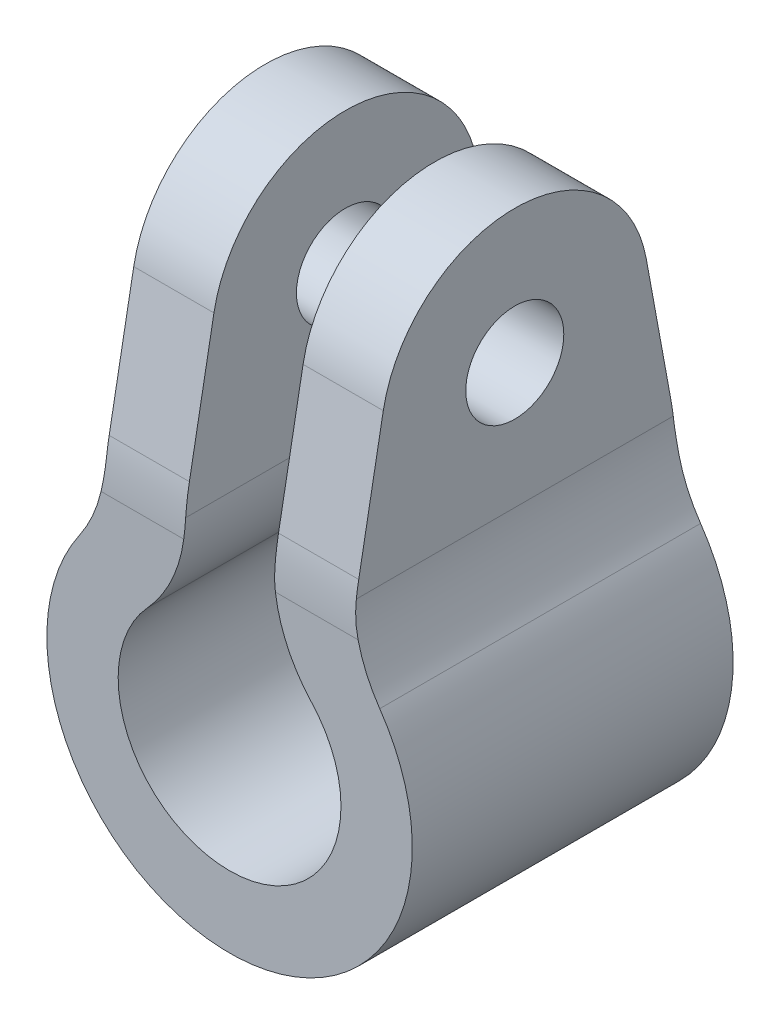
ISO-10303-21;
HEADER;
FILE_DESCRIPTION(('STEP AP214'),'2;1');
FILE_NAME('part.step','',(''),(''),'','','');
FILE_SCHEMA(('AUTOMOTIVE_DESIGN { 1 0 10303 214 1 1 1 1 }'));
ENDSEC;
DATA;
#1=APPLICATION_CONTEXT('core data for automotive mechanical design processes');
#2=APPLICATION_PROTOCOL_DEFINITION('international standard','automotive_design',2000,#1);
#3=PRODUCT_CONTEXT('',#1,'mechanical');
#4=PRODUCT('Part','Part','',(#3));
#5=PRODUCT_RELATED_PRODUCT_CATEGORY('part','',(#4));
#6=PRODUCT_DEFINITION_FORMATION('','',#4);
#7=PRODUCT_DEFINITION_CONTEXT('part definition',#1,'design');
#8=PRODUCT_DEFINITION('design','',#6,#7);
#9=PRODUCT_DEFINITION_SHAPE('','',#8);
#10=(LENGTH_UNIT() NAMED_UNIT(*) SI_UNIT(.MILLI.,.METRE.));
#11=(NAMED_UNIT(*) PLANE_ANGLE_UNIT() SI_UNIT($,.RADIAN.));
#12=(NAMED_UNIT(*) SI_UNIT($,.STERADIAN.) SOLID_ANGLE_UNIT());
#13=UNCERTAINTY_MEASURE_WITH_UNIT(LENGTH_MEASURE(1.E-05),#10,'distance_accuracy_value','');
#14=(GEOMETRIC_REPRESENTATION_CONTEXT(3) GLOBAL_UNCERTAINTY_ASSIGNED_CONTEXT((#13)) GLOBAL_UNIT_ASSIGNED_CONTEXT((#10,
#11,#12)) REPRESENTATION_CONTEXT('',''));
#15=CARTESIAN_POINT('',(0.,0.,0.));
#16=DIRECTION('',(0.,0.,1.));
#17=DIRECTION('',(1.,0.,0.));
#18=AXIS2_PLACEMENT_3D('',#15,#16,#17);
#19=CARTESIAN_POINT('',(7.,9.94044767603552,-9.));
#20=DIRECTION('',(0.,-0.180327868852459,0.983606557377049));
#21=DIRECTION('',(0.,-0.983606557377049,-0.180327868852459));
#22=AXIS2_PLACEMENT_3D('',#19,#20,#21);
#23=PLANE('',#22);
#24=DIRECTION('',(0.,-0.983606557377049,-0.180327868852459));
#25=VECTOR('',#24,1.);
#26=CARTESIAN_POINT('',(-2.5,9.94044767603552,-9.));
#27=LINE('',#26,#25);
#28=CARTESIAN_POINT('',(-2.5,18.792906692429,-7.37704918032787));
#29=VERTEX_POINT('',#28);
#30=CARTESIAN_POINT('',(-2.5,11.281729345186,-8.75409836065574));
#31=VERTEX_POINT('',#30);
#32=EDGE_CURVE('E452',#29,#31,#27,.T.);
#33=ORIENTED_EDGE('',*,*,#32,.T.);
#34=DIRECTION('',(-1.,0.,0.));
#35=VECTOR('',#34,1.);
#36=CARTESIAN_POINT('',(7.,11.281729345186,-8.75409836065574));
#37=LINE('',#36,#35);
#38=CARTESIAN_POINT('',(-7.,11.281729345186,-8.75409836065574));
#39=VERTEX_POINT('',#38);
#40=EDGE_CURVE('E11',#31,#39,#37,.T.);
#41=ORIENTED_EDGE('',*,*,#40,.T.);
#42=DIRECTION('',(0.,0.983606557377049,0.180327868852459));
#43=VECTOR('',#42,1.);
#44=CARTESIAN_POINT('',(-7.,9.94044767603552,-9.));
#45=LINE('',#44,#43);
#46=CARTESIAN_POINT('',(-7.,18.792906692429,-7.37704918032787));
#47=VERTEX_POINT('',#46);
#48=EDGE_CURVE('E461',#39,#47,#45,.T.);
#49=ORIENTED_EDGE('',*,*,#48,.T.);
#50=DIRECTION('',(-1.,0.,0.));
#51=VECTOR('',#50,1.);
#52=CARTESIAN_POINT('',(7.,18.792906692429,-7.37704918032787));
#53=LINE('',#52,#51);
#54=EDGE_CURVE('E204',#29,#47,#53,.T.);
#55=ORIENTED_EDGE('',*,*,#54,.F.);
#56=EDGE_LOOP('',(#33,#41,#49,#55));
#57=FACE_BOUND('',#56,.T.);
#58=ADVANCED_FACE('F38',(#57),#23,.F.);
#59=CARTESIAN_POINT('',(7.,17.4404476760355,0.));
#60=DIRECTION('',(-1.,0.,0.));
#61=DIRECTION('',(0.,0.,1.));
#62=AXIS2_PLACEMENT_3D('',#59,#60,#61);
#63=CYLINDRICAL_SURFACE('',#62,7.5);
#64=CARTESIAN_POINT('',(-2.5,17.4404476760355,0.));
#65=DIRECTION('',(-1.,0.,0.));
#66=DIRECTION('',(0.,0.,1.));
#67=AXIS2_PLACEMENT_3D('',#64,#65,#66);
#68=CIRCLE('',#67,7.5);
#69=CARTESIAN_POINT('',(-2.5,18.792906692429,7.37704918032787));
#70=VERTEX_POINT('',#69);
#71=EDGE_CURVE('E449',#70,#29,#68,.T.);
#72=ORIENTED_EDGE('',*,*,#71,.T.);
#73=ORIENTED_EDGE('',*,*,#54,.T.);
#74=CARTESIAN_POINT('',(-7.,17.4404476760355,0.));
#75=DIRECTION('',(1.,0.,0.));
#76=DIRECTION('',(0.,0.,-1.));
#77=AXIS2_PLACEMENT_3D('',#74,#75,#76);
#78=CIRCLE('',#77,7.5);
#79=CARTESIAN_POINT('',(-7.,18.792906692429,7.37704918032787));
#80=VERTEX_POINT('',#79);
#81=EDGE_CURVE('E466',#47,#80,#78,.T.);
#82=ORIENTED_EDGE('',*,*,#81,.T.);
#83=DIRECTION('',(-1.,0.,0.));
#84=VECTOR('',#83,1.);
#85=CARTESIAN_POINT('',(7.,18.792906692429,7.37704918032787));
#86=LINE('',#85,#84);
#87=EDGE_CURVE('E205',#70,#80,#86,.T.);
#88=ORIENTED_EDGE('',*,*,#87,.F.);
#89=EDGE_LOOP('',(#72,#73,#82,#88));
#90=FACE_BOUND('',#89,.T.);
#91=ADVANCED_FACE('F362',(#90),#63,.T.);
#92=CARTESIAN_POINT('',(7.,9.94044767603552,9.));
#93=DIRECTION('',(0.,-0.180327868852459,-0.983606557377049));
#94=DIRECTION('',(0.,0.983606557377049,-0.180327868852459));
#95=AXIS2_PLACEMENT_3D('',#92,#93,#94);
#96=PLANE('',#95);
#97=DIRECTION('',(0.,-0.983606557377049,0.180327868852459));
#98=VECTOR('',#97,1.);
#99=CARTESIAN_POINT('',(-7.,9.94044767603552,9.));
#100=LINE('',#99,#98);
#101=CARTESIAN_POINT('',(-7.,11.2817293451861,8.75409836065573));
#102=VERTEX_POINT('',#101);
#103=EDGE_CURVE('E210',#80,#102,#100,.T.);
#104=ORIENTED_EDGE('',*,*,#103,.T.);
#105=DIRECTION('',(-1.,0.,0.));
#106=VECTOR('',#105,1.);
#107=CARTESIAN_POINT('',(-2.5,11.2817293451861,8.75409836065573));
#108=LINE('',#107,#106);
#109=CARTESIAN_POINT('',(-2.5,11.2817293451861,8.75409836065573));
#110=VERTEX_POINT('',#109);
#111=EDGE_CURVE('E425',#102,#110,#108,.F.);
#112=ORIENTED_EDGE('',*,*,#111,.T.);
#113=DIRECTION('',(0.,0.983606557377049,-0.180327868852459));
#114=VECTOR('',#113,1.);
#115=CARTESIAN_POINT('',(-2.5,9.94044767603552,9.));
#116=LINE('',#115,#114);
#117=EDGE_CURVE('E228',#110,#70,#116,.T.);
#118=ORIENTED_EDGE('',*,*,#117,.T.);
#119=ORIENTED_EDGE('',*,*,#87,.T.);
#120=EDGE_LOOP('',(#104,#112,#118,#119));
#121=FACE_BOUND('',#120,.T.);
#122=ADVANCED_FACE('F371',(#121),#96,.F.);
#123=CARTESIAN_POINT('',(7.,17.4404476760355,0.));
#124=DIRECTION('',(-1.,0.,0.));
#125=DIRECTION('',(0.,0.,1.));
#126=AXIS2_PLACEMENT_3D('',#123,#124,#125);
#127=CYLINDRICAL_SURFACE('',#126,2.75);
#128=CARTESIAN_POINT('',(-2.5,17.4404476760355,0.));
#129=DIRECTION('',(-1.,0.,0.));
#130=DIRECTION('',(0.,0.,1.));
#131=AXIS2_PLACEMENT_3D('',#128,#129,#130);
#132=CIRCLE('',#131,2.75);
#133=CARTESIAN_POINT('',(-2.5,17.4404476760355,2.75));
#134=VERTEX_POINT('',#133);
#135=EDGE_CURVE('E225',#134,#134,#132,.T.);
#136=ORIENTED_EDGE('',*,*,#135,.F.);
#137=EDGE_LOOP('',(#136));
#138=FACE_BOUND('',#137,.T.);
#139=CARTESIAN_POINT('',(-7.,17.4404476760355,0.));
#140=DIRECTION('',(1.,0.,0.));
#141=DIRECTION('',(0.,0.,-1.));
#142=AXIS2_PLACEMENT_3D('',#139,#140,#141);
#143=CIRCLE('',#142,2.75);
#144=CARTESIAN_POINT('',(-7.,17.4404476760355,-2.75));
#145=VERTEX_POINT('',#144);
#146=EDGE_CURVE('E457',#145,#145,#143,.T.);
#147=ORIENTED_EDGE('',*,*,#146,.F.);
#148=EDGE_LOOP('',(#147));
#149=FACE_BOUND('',#148,.T.);
#150=ADVANCED_FACE('F508',(#138,#149),#127,.F.);
#151=CARTESIAN_POINT('',(0.,0.,9.));
#152=DIRECTION('',(0.,0.,-1.));
#153=DIRECTION('',(-1.,0.,0.));
#154=AXIS2_PLACEMENT_3D('',#151,#152,#153);
#155=CYLINDRICAL_SURFACE('',#154,10.25);
#156=CARTESIAN_POINT('',(0.,0.,9.));
#157=DIRECTION('',(0.,0.,1.));
#158=DIRECTION('',(1.,0.,0.));
#159=AXIS2_PLACEMENT_3D('',#156,#157,#158);
#160=CIRCLE('',#159,10.25);
#161=CARTESIAN_POINT('',(-8.42465753424658,5.83846259135592,9.));
#162=VERTEX_POINT('',#161);
#163=CARTESIAN_POINT('',(8.42465753424658,5.83846259135592,9.));
#164=VERTEX_POINT('',#163);
#165=EDGE_CURVE('E214',#162,#164,#160,.T.);
#166=ORIENTED_EDGE('',*,*,#165,.F.);
#167=DIRECTION('',(0.,0.,-1.));
#168=VECTOR('',#167,1.);
#169=CARTESIAN_POINT('',(-8.42465753424658,5.83846259135592,9.));
#170=LINE('',#169,#168);
#171=CARTESIAN_POINT('',(-8.42465753424658,5.83846259135592,-9.));
#172=VERTEX_POINT('',#171);
#173=EDGE_CURVE('E470',#162,#172,#170,.T.);
#174=ORIENTED_EDGE('',*,*,#173,.T.);
#175=CARTESIAN_POINT('',(0.,0.,-9.));
#176=DIRECTION('',(0.,0.,1.));
#177=DIRECTION('',(1.,0.,0.));
#178=AXIS2_PLACEMENT_3D('',#175,#176,#177);
#179=CIRCLE('',#178,10.25);
#180=CARTESIAN_POINT('',(8.42465753424658,5.83846259135592,-9.));
#181=VERTEX_POINT('',#180);
#182=EDGE_CURVE('E213',#172,#181,#179,.T.);
#183=ORIENTED_EDGE('',*,*,#182,.T.);
#184=DIRECTION('',(0.,0.,-1.));
#185=VECTOR('',#184,1.);
#186=CARTESIAN_POINT('',(8.42465753424658,5.83846259135592,9.));
#187=LINE('',#186,#185);
#188=EDGE_CURVE('E439',#181,#164,#187,.F.);
#189=ORIENTED_EDGE('',*,*,#188,.T.);
#190=EDGE_LOOP('',(#166,#174,#183,#189));
#191=FACE_BOUND('',#190,.T.);
#192=ADVANCED_FACE('F296',(#191),#155,.T.);
#193=CARTESIAN_POINT('',(0.,0.,9.));
#194=DIRECTION('',(0.,0.,-1.));
#195=DIRECTION('',(-1.,0.,0.));
#196=AXIS2_PLACEMENT_3D('',#193,#194,#195);
#197=CYLINDRICAL_SURFACE('',#196,6.25);
#198=CARTESIAN_POINT('',(0.,0.,-9.));
#199=DIRECTION('',(0.,0.,-1.));
#200=DIRECTION('',(1.,0.,0.));
#201=AXIS2_PLACEMENT_3D('',#198,#199,#200);
#202=CIRCLE('',#201,6.25);
#203=CARTESIAN_POINT('',(4.60526315789474,4.22540545350827,-9.));
#204=VERTEX_POINT('',#203);
#205=CARTESIAN_POINT('',(-4.60526315789474,4.22540545350827,-9.));
#206=VERTEX_POINT('',#205);
#207=EDGE_CURVE('E218',#204,#206,#202,.T.);
#208=ORIENTED_EDGE('',*,*,#207,.T.);
#209=DIRECTION('',(0.,0.,-1.));
#210=VECTOR('',#209,1.);
#211=CARTESIAN_POINT('',(-4.60526315789474,4.22540545350827,9.));
#212=LINE('',#211,#210);
#213=CARTESIAN_POINT('',(-4.60526315789474,4.22540545350827,9.));
#214=VERTEX_POINT('',#213);
#215=EDGE_CURVE('E241',#206,#214,#212,.F.);
#216=ORIENTED_EDGE('',*,*,#215,.T.);
#217=CARTESIAN_POINT('',(0.,0.,9.));
#218=DIRECTION('',(0.,0.,-1.));
#219=DIRECTION('',(1.,0.,0.));
#220=AXIS2_PLACEMENT_3D('',#217,#218,#219);
#221=CIRCLE('',#220,6.25);
#222=CARTESIAN_POINT('',(4.60526315789474,4.22540545350827,9.));
#223=VERTEX_POINT('',#222);
#224=EDGE_CURVE('E217',#223,#214,#221,.T.);
#225=ORIENTED_EDGE('',*,*,#224,.F.);
#226=DIRECTION('',(0.,0.,-1.));
#227=VECTOR('',#226,1.);
#228=CARTESIAN_POINT('',(4.60526315789474,4.22540545350827,9.));
#229=LINE('',#228,#227);
#230=EDGE_CURVE('E239',#223,#204,#229,.T.);
#231=ORIENTED_EDGE('',*,*,#230,.T.);
#232=EDGE_LOOP('',(#208,#216,#225,#231));
#233=FACE_BOUND('',#232,.T.);
#234=ADVANCED_FACE('F480',(#233),#197,.F.);
#235=CARTESIAN_POINT('',(0.,0.,9.));
#236=DIRECTION('',(0.,0.,1.));
#237=DIRECTION('',(1.,0.,0.));
#238=AXIS2_PLACEMENT_3D('',#235,#236,#237);
#239=PLANE('',#238);
#240=CARTESIAN_POINT('',(-10.5,9.63392443399885,9.));
#241=DIRECTION('',(0.,0.,1.));
#242=DIRECTION('',(1.,0.,0.));
#243=AXIS2_PLACEMENT_3D('',#240,#241,#242);
#244=CIRCLE('',#243,8.);
#245=CARTESIAN_POINT('',(-2.57015057846987,8.57681131239917,9.));
#246=VERTEX_POINT('',#245);
#247=EDGE_CURVE('E246',#214,#246,#244,.T.);
#248=ORIENTED_EDGE('',*,*,#247,.T.);
#249=DIRECTION('',(-1.,0.,0.));
#250=VECTOR('',#249,1.);
#251=CARTESIAN_POINT('',(-7.01294178352441,8.57681131239917,9.));
#252=LINE('',#251,#250);
#253=CARTESIAN_POINT('',(-7.20942509987394,8.57681131239917,9.));
#254=VERTEX_POINT('',#253);
#255=EDGE_CURVE('E271',#246,#254,#252,.T.);
#256=ORIENTED_EDGE('',*,*,#255,.T.);
#257=CARTESIAN_POINT('',(-15.,10.3953114431459,9.));
#258=DIRECTION('',(0.,0.,1.));
#259=DIRECTION('',(1.,0.,0.));
#260=AXIS2_PLACEMENT_3D('',#257,#258,#259);
#261=CIRCLE('',#260,8.);
#262=EDGE_CURVE('E258',#254,#162,#261,.F.);
#263=ORIENTED_EDGE('',*,*,#262,.T.);
#264=ORIENTED_EDGE('',*,*,#165,.T.);
#265=CARTESIAN_POINT('',(15.,10.3953114431459,9.));
#266=DIRECTION('',(0.,0.,1.));
#267=DIRECTION('',(1.,0.,0.));
#268=AXIS2_PLACEMENT_3D('',#265,#266,#267);
#269=CIRCLE('',#268,8.);
#270=CARTESIAN_POINT('',(7.20942509987394,8.57681131239917,9.));
#271=VERTEX_POINT('',#270);
#272=EDGE_CURVE('E263',#164,#271,#269,.F.);
#273=ORIENTED_EDGE('',*,*,#272,.T.);
#274=DIRECTION('',(-1.,0.,0.));
#275=VECTOR('',#274,1.);
#276=CARTESIAN_POINT('',(2.5,8.57681131239917,9.));
#277=LINE('',#276,#275);
#278=CARTESIAN_POINT('',(2.57015057846987,8.57681131239917,9.));
#279=VERTEX_POINT('',#278);
#280=EDGE_CURVE('E268',#271,#279,#277,.T.);
#281=ORIENTED_EDGE('',*,*,#280,.T.);
#282=CARTESIAN_POINT('',(10.5,9.63392443399885,9.));
#283=DIRECTION('',(0.,0.,1.));
#284=DIRECTION('',(1.,0.,0.));
#285=AXIS2_PLACEMENT_3D('',#282,#283,#284);
#286=CIRCLE('',#285,8.);
#287=EDGE_CURVE('E244',#279,#223,#286,.T.);
#288=ORIENTED_EDGE('',*,*,#287,.T.);
#289=ORIENTED_EDGE('',*,*,#224,.T.);
#290=EDGE_LOOP('',(#248,#256,#263,#264,#273,#281,#288,#289));
#291=FACE_BOUND('',#290,.T.);
#292=ADVANCED_FACE('F476',(#291),#239,.T.);
#293=CARTESIAN_POINT('',(0.,0.,-9.));
#294=DIRECTION('',(0.,0.,1.));
#295=DIRECTION('',(1.,0.,0.));
#296=AXIS2_PLACEMENT_3D('',#293,#294,#295);
#297=PLANE('',#296);
#298=CARTESIAN_POINT('',(10.5,9.63392443399885,-9.));
#299=DIRECTION('',(0.,0.,1.));
#300=DIRECTION('',(1.,0.,0.));
#301=AXIS2_PLACEMENT_3D('',#298,#299,#300);
#302=CIRCLE('',#301,8.);
#303=CARTESIAN_POINT('',(2.57015057846987,8.57681131239916,-9.));
#304=VERTEX_POINT('',#303);
#305=EDGE_CURVE('E252',#204,#304,#302,.F.);
#306=ORIENTED_EDGE('',*,*,#305,.T.);
#307=DIRECTION('',(-1.,0.,0.));
#308=VECTOR('',#307,1.);
#309=CARTESIAN_POINT('',(0.,8.57681131239916,-9.));
#310=LINE('',#309,#308);
#311=CARTESIAN_POINT('',(7.20942509987394,8.57681131239916,-9.));
#312=VERTEX_POINT('',#311);
#313=EDGE_CURVE('E47',#304,#312,#310,.F.);
#314=ORIENTED_EDGE('',*,*,#313,.T.);
#315=CARTESIAN_POINT('',(15.,10.3953114431459,-9.));
#316=DIRECTION('',(0.,0.,1.));
#317=DIRECTION('',(1.,0.,0.));
#318=AXIS2_PLACEMENT_3D('',#315,#316,#317);
#319=CIRCLE('',#318,8.);
#320=EDGE_CURVE('E266',#312,#181,#319,.T.);
#321=ORIENTED_EDGE('',*,*,#320,.T.);
#322=ORIENTED_EDGE('',*,*,#182,.F.);
#323=CARTESIAN_POINT('',(-15.,10.3953114431459,-9.));
#324=DIRECTION('',(0.,0.,1.));
#325=DIRECTION('',(1.,0.,0.));
#326=AXIS2_PLACEMENT_3D('',#323,#324,#325);
#327=CIRCLE('',#326,8.);
#328=CARTESIAN_POINT('',(-7.20942509987394,8.57681131239916,-9.));
#329=VERTEX_POINT('',#328);
#330=EDGE_CURVE('E260',#172,#329,#327,.T.);
#331=ORIENTED_EDGE('',*,*,#330,.T.);
#332=DIRECTION('',(-1.,0.,0.));
#333=VECTOR('',#332,1.);
#334=CARTESIAN_POINT('',(0.,8.57681131239916,-9.));
#335=LINE('',#334,#333);
#336=CARTESIAN_POINT('',(-2.57015057846987,8.57681131239916,-9.));
#337=VERTEX_POINT('',#336);
#338=EDGE_CURVE('E395',#329,#337,#335,.F.);
#339=ORIENTED_EDGE('',*,*,#338,.T.);
#340=CARTESIAN_POINT('',(-10.5,9.63392443399885,-9.));
#341=DIRECTION('',(0.,0.,1.));
#342=DIRECTION('',(1.,0.,0.));
#343=AXIS2_PLACEMENT_3D('',#340,#341,#342);
#344=CIRCLE('',#343,8.);
#345=EDGE_CURVE('E254',#337,#206,#344,.F.);
#346=ORIENTED_EDGE('',*,*,#345,.T.);
#347=ORIENTED_EDGE('',*,*,#207,.F.);
#348=EDGE_LOOP('',(#306,#314,#321,#322,#331,#339,#346,#347));
#349=FACE_BOUND('',#348,.T.);
#350=ADVANCED_FACE('F398',(#349),#297,.F.);
#351=CARTESIAN_POINT('',(7.,17.4404476760355,0.));
#352=DIRECTION('',(1.,0.,0.));
#353=DIRECTION('',(0.,0.,-1.));
#354=AXIS2_PLACEMENT_3D('',#351,#352,#353);
#355=PLANE('',#354);
#356=CARTESIAN_POINT('',(7.,17.4404476760355,0.));
#357=DIRECTION('',(1.,0.,0.));
#358=DIRECTION('',(0.,0.,-1.));
#359=AXIS2_PLACEMENT_3D('',#356,#357,#358);
#360=CIRCLE('',#359,2.75);
#361=CARTESIAN_POINT('',(7.,17.4404476760355,-2.75));
#362=VERTEX_POINT('',#361);
#363=EDGE_CURVE('E458',#362,#362,#360,.T.);
#364=ORIENTED_EDGE('',*,*,#363,.F.);
#365=EDGE_LOOP('',(#364));
#366=FACE_BOUND('',#365,.T.);
#367=DIRECTION('',(0.,-0.983606557377049,0.180327868852459));
#368=VECTOR('',#367,1.);
#369=CARTESIAN_POINT('',(7.,9.94044767603552,9.));
#370=LINE('',#369,#368);
#371=CARTESIAN_POINT('',(7.,18.792906692429,7.37704918032787));
#372=VERTEX_POINT('',#371);
#373=CARTESIAN_POINT('',(7.,11.2817293451861,8.75409836065573));
#374=VERTEX_POINT('',#373);
#375=EDGE_CURVE('E203',#372,#374,#370,.T.);
#376=ORIENTED_EDGE('',*,*,#375,.T.);
#377=CARTESIAN_POINT('',(7.,8.57681131239917,-6.));
#378=DIRECTION('',(1.,0.,0.));
#379=DIRECTION('',(0.,0.,-1.));
#380=AXIS2_PLACEMENT_3D('',#377,#378,#379);
#381=CIRCLE('',#380,15.);
#382=CARTESIAN_POINT('',(7.,10.3953114431459,8.88936053947496));
#383=VERTEX_POINT('',#382);
#384=EDGE_CURVE('E485',#374,#383,#381,.T.);
#385=ORIENTED_EDGE('',*,*,#384,.T.);
#386=DIRECTION('',(0.,0.,-1.));
#387=VECTOR('',#386,1.);
#388=CARTESIAN_POINT('',(7.,10.3953114431459,0.));
#389=LINE('',#388,#387);
#390=CARTESIAN_POINT('',(7.,10.3953114431459,-8.88936053947496));
#391=VERTEX_POINT('',#390);
#392=EDGE_CURVE('E237',#383,#391,#389,.T.);
#393=ORIENTED_EDGE('',*,*,#392,.T.);
#394=CARTESIAN_POINT('',(7.,8.57681131239916,6.));
#395=DIRECTION('',(1.,0.,0.));
#396=DIRECTION('',(0.,0.,-1.));
#397=AXIS2_PLACEMENT_3D('',#394,#395,#396);
#398=CIRCLE('',#397,15.);
#399=CARTESIAN_POINT('',(7.,11.281729345186,-8.75409836065574));
#400=VERTEX_POINT('',#399);
#401=EDGE_CURVE('E61',#391,#400,#398,.T.);
#402=ORIENTED_EDGE('',*,*,#401,.T.);
#403=DIRECTION('',(0.,0.983606557377049,0.180327868852459));
#404=VECTOR('',#403,1.);
#405=CARTESIAN_POINT('',(7.,9.94044767603552,-9.));
#406=LINE('',#405,#404);
#407=CARTESIAN_POINT('',(7.,18.792906692429,-7.37704918032787));
#408=VERTEX_POINT('',#407);
#409=EDGE_CURVE('E388',#400,#408,#406,.T.);
#410=ORIENTED_EDGE('',*,*,#409,.T.);
#411=CARTESIAN_POINT('',(7.,17.4404476760355,0.));
#412=DIRECTION('',(1.,0.,0.));
#413=DIRECTION('',(0.,0.,-1.));
#414=AXIS2_PLACEMENT_3D('',#411,#412,#413);
#415=CIRCLE('',#414,7.5);
#416=EDGE_CURVE('E390',#408,#372,#415,.T.);
#417=ORIENTED_EDGE('',*,*,#416,.T.);
#418=EDGE_LOOP('',(#376,#385,#393,#402,#410,#417));
#419=FACE_BOUND('',#418,.T.);
#420=ADVANCED_FACE('F384',(#366,#419),#355,.T.);
#421=CARTESIAN_POINT('',(-7.,17.4404476760355,0.));
#422=DIRECTION('',(1.,0.,0.));
#423=DIRECTION('',(0.,0.,-1.));
#424=AXIS2_PLACEMENT_3D('',#421,#422,#423);
#425=PLANE('',#424);
#426=ORIENTED_EDGE('',*,*,#146,.T.);
#427=EDGE_LOOP('',(#426));
#428=FACE_BOUND('',#427,.T.);
#429=DIRECTION('',(0.,0.,1.));
#430=VECTOR('',#429,1.);
#431=CARTESIAN_POINT('',(-7.,10.3953114431459,9.));
#432=LINE('',#431,#430);
#433=CARTESIAN_POINT('',(-7.,10.3953114431459,-8.88936053947496));
#434=VERTEX_POINT('',#433);
#435=CARTESIAN_POINT('',(-7.,10.3953114431459,8.88936053947496));
#436=VERTEX_POINT('',#435);
#437=EDGE_CURVE('E231',#434,#436,#432,.T.);
#438=ORIENTED_EDGE('',*,*,#437,.T.);
#439=CARTESIAN_POINT('',(-7.,8.57681131239917,-6.));
#440=DIRECTION('',(1.,0.,0.));
#441=DIRECTION('',(0.,0.,-1.));
#442=AXIS2_PLACEMENT_3D('',#439,#440,#441);
#443=CIRCLE('',#442,15.);
#444=EDGE_CURVE('E427',#436,#102,#443,.F.);
#445=ORIENTED_EDGE('',*,*,#444,.T.);
#446=ORIENTED_EDGE('',*,*,#103,.F.);
#447=ORIENTED_EDGE('',*,*,#81,.F.);
#448=ORIENTED_EDGE('',*,*,#48,.F.);
#449=CARTESIAN_POINT('',(-7.,8.57681131239916,6.));
#450=DIRECTION('',(1.,0.,0.));
#451=DIRECTION('',(0.,0.,-1.));
#452=AXIS2_PLACEMENT_3D('',#449,#450,#451);
#453=CIRCLE('',#452,15.);
#454=EDGE_CURVE('E428',#39,#434,#453,.F.);
#455=ORIENTED_EDGE('',*,*,#454,.T.);
#456=EDGE_LOOP('',(#438,#445,#446,#447,#448,#455));
#457=FACE_BOUND('',#456,.T.);
#458=ADVANCED_FACE('F377',(#428,#457),#425,.F.);
#459=ORIENTED_EDGE('',*,*,#409,.F.);
#460=DIRECTION('',(-1.,0.,0.));
#461=VECTOR('',#460,1.);
#462=CARTESIAN_POINT('',(7.,11.281729345186,-8.75409836065574));
#463=LINE('',#462,#461);
#464=CARTESIAN_POINT('',(2.5,11.281729345186,-8.75409836065574));
#465=VERTEX_POINT('',#464);
#466=EDGE_CURVE('E322',#400,#465,#463,.T.);
#467=ORIENTED_EDGE('',*,*,#466,.T.);
#468=DIRECTION('',(0.,0.983606557377049,0.180327868852459));
#469=VECTOR('',#468,1.);
#470=CARTESIAN_POINT('',(2.5,9.94044767603552,-9.));
#471=LINE('',#470,#469);
#472=CARTESIAN_POINT('',(2.5,18.792906692429,-7.37704918032787));
#473=VERTEX_POINT('',#472);
#474=EDGE_CURVE('E189',#465,#473,#471,.T.);
#475=ORIENTED_EDGE('',*,*,#474,.T.);
#476=EDGE_CURVE('E186',#408,#473,#53,.T.);
#477=ORIENTED_EDGE('',*,*,#476,.F.);
#478=EDGE_LOOP('',(#459,#467,#475,#477));
#479=FACE_BOUND('',#478,.T.);
#480=ADVANCED_FACE('F365',(#479),#23,.F.);
#481=CARTESIAN_POINT('',(2.5,17.4404476760355,0.));
#482=DIRECTION('',(1.,0.,0.));
#483=DIRECTION('',(0.,1.,0.));
#484=AXIS2_PLACEMENT_3D('',#481,#482,#483);
#485=CIRCLE('',#484,7.5);
#486=CARTESIAN_POINT('',(2.5,18.792906692429,7.37704918032787));
#487=VERTEX_POINT('',#486);
#488=EDGE_CURVE('E178',#473,#487,#485,.T.);
#489=ORIENTED_EDGE('',*,*,#488,.T.);
#490=EDGE_CURVE('E183',#372,#487,#86,.T.);
#491=ORIENTED_EDGE('',*,*,#490,.F.);
#492=ORIENTED_EDGE('',*,*,#416,.F.);
#493=ORIENTED_EDGE('',*,*,#476,.T.);
#494=EDGE_LOOP('',(#489,#491,#492,#493));
#495=FACE_BOUND('',#494,.T.);
#496=ADVANCED_FACE('F180',(#495),#63,.T.);
#497=DIRECTION('',(0.,-0.983606557377049,0.180327868852459));
#498=VECTOR('',#497,1.);
#499=CARTESIAN_POINT('',(2.5,9.94044767603552,9.));
#500=LINE('',#499,#498);
#501=CARTESIAN_POINT('',(2.5,11.2817293451861,8.75409836065573));
#502=VERTEX_POINT('',#501);
#503=EDGE_CURVE('E190',#487,#502,#500,.T.);
#504=ORIENTED_EDGE('',*,*,#503,.T.);
#505=DIRECTION('',(-1.,0.,0.));
#506=VECTOR('',#505,1.);
#507=CARTESIAN_POINT('',(7.01294178352441,11.2817293451861,8.75409836065573));
#508=LINE('',#507,#506);
#509=EDGE_CURVE('E487',#502,#374,#508,.F.);
#510=ORIENTED_EDGE('',*,*,#509,.T.);
#511=ORIENTED_EDGE('',*,*,#375,.F.);
#512=ORIENTED_EDGE('',*,*,#490,.T.);
#513=EDGE_LOOP('',(#504,#510,#511,#512));
#514=FACE_BOUND('',#513,.T.);
#515=ADVANCED_FACE('F201',(#514),#96,.F.);
#516=CARTESIAN_POINT('',(2.5,17.4404476760355,0.));
#517=DIRECTION('',(1.,0.,0.));
#518=DIRECTION('',(0.,1.,0.));
#519=AXIS2_PLACEMENT_3D('',#516,#517,#518);
#520=CIRCLE('',#519,2.75);
#521=CARTESIAN_POINT('',(2.5,20.1904476760355,0.));
#522=VERTEX_POINT('',#521);
#523=EDGE_CURVE('E199',#522,#522,#520,.T.);
#524=ORIENTED_EDGE('',*,*,#523,.F.);
#525=EDGE_LOOP('',(#524));
#526=FACE_BOUND('',#525,.T.);
#527=ORIENTED_EDGE('',*,*,#363,.T.);
#528=EDGE_LOOP('',(#527));
#529=FACE_BOUND('',#528,.T.);
#530=ADVANCED_FACE('F500',(#526,#529),#127,.F.);
#531=CARTESIAN_POINT('',(2.5,24.9404476760355,-9.));
#532=DIRECTION('',(1.,0.,0.));
#533=DIRECTION('',(0.,1.,0.));
#534=AXIS2_PLACEMENT_3D('',#531,#532,#533);
#535=PLANE('',#534);
#536=ORIENTED_EDGE('',*,*,#523,.T.);
#537=EDGE_LOOP('',(#536));
#538=FACE_BOUND('',#537,.T.);
#539=DIRECTION('',(0.,0.,-1.));
#540=VECTOR('',#539,1.);
#541=CARTESIAN_POINT('',(2.5,9.63392443399885,-9.));
#542=LINE('',#541,#540);
#543=CARTESIAN_POINT('',(2.5,9.63392443399885,-8.96270402862202));
#544=VERTEX_POINT('',#543);
#545=CARTESIAN_POINT('',(2.5,9.63392443399885,8.96270402862202));
#546=VERTEX_POINT('',#545);
#547=EDGE_CURVE('E256',#544,#546,#542,.F.);
#548=ORIENTED_EDGE('',*,*,#547,.T.);
#549=CARTESIAN_POINT('',(2.5,8.57681131239917,-6.));
#550=DIRECTION('',(1.,0.,0.));
#551=DIRECTION('',(0.,1.,0.));
#552=AXIS2_PLACEMENT_3D('',#549,#550,#551);
#553=CIRCLE('',#552,15.);
#554=EDGE_CURVE('E196',#546,#502,#553,.F.);
#555=ORIENTED_EDGE('',*,*,#554,.T.);
#556=ORIENTED_EDGE('',*,*,#503,.F.);
#557=ORIENTED_EDGE('',*,*,#488,.F.);
#558=ORIENTED_EDGE('',*,*,#474,.F.);
#559=CARTESIAN_POINT('',(2.5,8.57681131239916,6.));
#560=DIRECTION('',(1.,0.,0.));
#561=DIRECTION('',(0.,1.,0.));
#562=AXIS2_PLACEMENT_3D('',#559,#560,#561);
#563=CIRCLE('',#562,15.);
#564=EDGE_CURVE('E341',#465,#544,#563,.F.);
#565=ORIENTED_EDGE('',*,*,#564,.T.);
#566=EDGE_LOOP('',(#548,#555,#556,#557,#558,#565));
#567=FACE_BOUND('',#566,.T.);
#568=ADVANCED_FACE('F194',(#538,#567),#535,.F.);
#569=CARTESIAN_POINT('',(-2.5,9.94044767603553,-9.));
#570=DIRECTION('',(-1.,0.,0.));
#571=DIRECTION('',(0.,0.,1.));
#572=AXIS2_PLACEMENT_3D('',#569,#570,#571);
#573=PLANE('',#572);
#574=ORIENTED_EDGE('',*,*,#117,.F.);
#575=CARTESIAN_POINT('',(-2.5,8.57681131239917,-6.));
#576=DIRECTION('',(-1.,0.,0.));
#577=DIRECTION('',(0.,0.,1.));
#578=AXIS2_PLACEMENT_3D('',#575,#576,#577);
#579=CIRCLE('',#578,15.);
#580=CARTESIAN_POINT('',(-2.5,9.63392443399885,8.96270402862202));
#581=VERTEX_POINT('',#580);
#582=EDGE_CURVE('E412',#110,#581,#579,.F.);
#583=ORIENTED_EDGE('',*,*,#582,.T.);
#584=DIRECTION('',(0.,0.,-1.));
#585=VECTOR('',#584,1.);
#586=CARTESIAN_POINT('',(-2.5,9.63392443399885,-9.));
#587=LINE('',#586,#585);
#588=CARTESIAN_POINT('',(-2.5,9.63392443399885,-8.96270402862202));
#589=VERTEX_POINT('',#588);
#590=EDGE_CURVE('E249',#581,#589,#587,.T.);
#591=ORIENTED_EDGE('',*,*,#590,.T.);
#592=CARTESIAN_POINT('',(-2.5,8.57681131239916,6.));
#593=DIRECTION('',(-1.,0.,0.));
#594=DIRECTION('',(0.,0.,1.));
#595=AXIS2_PLACEMENT_3D('',#592,#593,#594);
#596=CIRCLE('',#595,15.);
#597=EDGE_CURVE('E410',#589,#31,#596,.F.);
#598=ORIENTED_EDGE('',*,*,#597,.T.);
#599=ORIENTED_EDGE('',*,*,#32,.F.);
#600=ORIENTED_EDGE('',*,*,#71,.F.);
#601=EDGE_LOOP('',(#574,#583,#591,#598,#599,#600));
#602=FACE_BOUND('',#601,.T.);
#603=ORIENTED_EDGE('',*,*,#135,.T.);
#604=EDGE_LOOP('',(#603));
#605=FACE_BOUND('',#604,.T.);
#606=ADVANCED_FACE('F294',(#602,#605),#573,.F.);
#607=CARTESIAN_POINT('',(-15.,10.3953114431459,9.));
#608=DIRECTION('',(0.,0.,-1.));
#609=DIRECTION('',(-1.,0.,0.));
#610=AXIS2_PLACEMENT_3D('',#607,#608,#609);
#611=CYLINDRICAL_SURFACE('',#610,8.);
#612=ORIENTED_EDGE('',*,*,#262,.F.);
#613=CARTESIAN_POINT('',(-7.20942509987394,8.57681131239917,9.));
#614=CARTESIAN_POINT('',(-7.17450630201103,8.72636007634046,9.00001062438415));
#615=CARTESIAN_POINT('',(-7.14391350420681,8.87692074575163,8.99776350161575));
#616=CARTESIAN_POINT('',(-7.09156256415532,9.17878240322184,8.98867096121309));
#617=CARTESIAN_POINT('',(-7.06976796862354,9.33007765234815,8.98184483544329));
#618=CARTESIAN_POINT('',(-7.03490262366823,9.6333881469788,8.96351319687304));
#619=CARTESIAN_POINT('',(-7.02183187465456,9.78540339251696,8.95200768385275));
#620=CARTESIAN_POINT('',(-7.00435700387803,10.0901462651767,8.92425570929429));
#621=CARTESIAN_POINT('',(-6.99998955134079,10.2428742002517,8.90798951818554));
#622=CARTESIAN_POINT('',(-7.,10.3953114431459,8.88936053947496));
#623=B_SPLINE_CURVE_WITH_KNOTS('',3,(#613,#614,#615,#616,#617,#618,#619,#620,#621,#622),
.UNSPECIFIED.,.F.,.F.,(4,2,2,2,4),(0.,0.460636263269452,0.919343901404839,1.37805156108996,
1.83868782205931),.UNSPECIFIED.);
#624=EDGE_CURVE('E281',#254,#436,#623,.T.);
#625=ORIENTED_EDGE('',*,*,#624,.T.);
#626=ORIENTED_EDGE('',*,*,#437,.F.);
#627=CARTESIAN_POINT('',(-7.,10.3953114431459,-8.88936053947496));
#628=CARTESIAN_POINT('',(-6.99998955134079,10.2428742002517,-8.90798951818554));
#629=CARTESIAN_POINT('',(-7.00435700387803,10.0901462651767,-8.92425570929429));
#630=CARTESIAN_POINT('',(-7.02183187465455,9.78540339251696,-8.95200768385275));
#631=CARTESIAN_POINT('',(-7.03490262366823,9.6333881469788,-8.96351319687304));
#632=CARTESIAN_POINT('',(-7.06976796862354,9.33007765234815,-8.98184483544329));
#633=CARTESIAN_POINT('',(-7.09156256415533,9.17878240322183,-8.98867096121309));
#634=CARTESIAN_POINT('',(-7.14391350420681,8.87692074575162,-8.99776350161575));
#635=CARTESIAN_POINT('',(-7.17450630201103,8.72636007634045,-9.00001062438415));
#636=CARTESIAN_POINT('',(-7.20942509987394,8.57681131239916,-9.));
#637=B_SPLINE_CURVE_WITH_KNOTS('',3,(#627,#628,#629,#630,#631,#632,#633,#634,#635,#636),
.UNSPECIFIED.,.F.,.F.,(4,2,2,2,4),(0.,0.460636260969352,0.91934392065448,1.37805155878987,
1.83868782205933),.UNSPECIFIED.);
#638=EDGE_CURVE('E274',#434,#329,#637,.T.);
#639=ORIENTED_EDGE('',*,*,#638,.T.);
#640=ORIENTED_EDGE('',*,*,#330,.F.);
#641=ORIENTED_EDGE('',*,*,#173,.F.);
#642=EDGE_LOOP('',(#612,#625,#626,#639,#640,#641));
#643=FACE_BOUND('',#642,.T.);
#644=ADVANCED_FACE('F288',(#643),#611,.F.);
#645=CARTESIAN_POINT('',(15.,10.3953114431459,9.));
#646=DIRECTION('',(0.,0.,-1.));
#647=DIRECTION('',(-1.,0.,0.));
#648=AXIS2_PLACEMENT_3D('',#645,#646,#647);
#649=CYLINDRICAL_SURFACE('',#648,8.);
#650=ORIENTED_EDGE('',*,*,#392,.F.);
#651=CARTESIAN_POINT('',(7.,10.3953114431459,8.88936053947496));
#652=CARTESIAN_POINT('',(6.99998955134079,10.2428742002517,8.90798951818554));
#653=CARTESIAN_POINT('',(7.00435700387803,10.0901462651767,8.92425570929429));
#654=CARTESIAN_POINT('',(7.02183187465455,9.78540339251696,8.95200768385275));
#655=CARTESIAN_POINT('',(7.03490262366823,9.6333881469788,8.96351319687304));
#656=CARTESIAN_POINT('',(7.06976796862354,9.33007765234815,8.98184483544329));
#657=CARTESIAN_POINT('',(7.09156256415533,9.17878240322184,8.98867096121309));
#658=CARTESIAN_POINT('',(7.14391350420681,8.87692074575163,8.99776350161575));
#659=CARTESIAN_POINT('',(7.17450630201103,8.72636007634046,9.00001062438415));
#660=CARTESIAN_POINT('',(7.20942509987394,8.57681131239917,9.));
#661=B_SPLINE_CURVE_WITH_KNOTS('',3,(#651,#652,#653,#654,#655,#656,#657,#658,#659,#660),
.UNSPECIFIED.,.F.,.F.,(4,2,2,2,4),(0.,0.46063626096935,0.919343920654474,1.37805155878986,
1.83868782205931),.UNSPECIFIED.);
#662=EDGE_CURVE('E315',#383,#271,#661,.T.);
#663=ORIENTED_EDGE('',*,*,#662,.T.);
#664=ORIENTED_EDGE('',*,*,#272,.F.);
#665=ORIENTED_EDGE('',*,*,#188,.F.);
#666=ORIENTED_EDGE('',*,*,#320,.F.);
#667=CARTESIAN_POINT('',(7.20942509987394,8.57681131239916,-9.));
#668=CARTESIAN_POINT('',(7.17450630201103,8.72636007634045,-9.00001062438415));
#669=CARTESIAN_POINT('',(7.14391350420681,8.87692074575162,-8.99776350161575));
#670=CARTESIAN_POINT('',(7.09156256415533,9.17878240322183,-8.98867096121309));
#671=CARTESIAN_POINT('',(7.06976796862354,9.33007765234815,-8.98184483544329));
#672=CARTESIAN_POINT('',(7.03490262366823,9.6333881469788,-8.96351319687304));
#673=CARTESIAN_POINT('',(7.02183187465455,9.78540339251696,-8.95200768385275));
#674=CARTESIAN_POINT('',(7.00435700387803,10.0901462651767,-8.92425570929429));
#675=CARTESIAN_POINT('',(6.99998955134079,10.2428742002517,-8.90798951818554));
#676=CARTESIAN_POINT('',(7.,10.3953114431459,-8.88936053947496));
#677=B_SPLINE_CURVE_WITH_KNOTS('',3,(#667,#668,#669,#670,#671,#672,#673,#674,#675,#676),
.UNSPECIFIED.,.F.,.F.,(4,2,2,2,4),(0.,0.460636263269457,0.919343901404846,1.37805156108997,
1.83868782205933),.UNSPECIFIED.);
#678=EDGE_CURVE('E308',#312,#391,#677,.T.);
#679=ORIENTED_EDGE('',*,*,#678,.T.);
#680=EDGE_LOOP('',(#650,#663,#664,#665,#666,#679));
#681=FACE_BOUND('',#680,.T.);
#682=ADVANCED_FACE('F293',(#681),#649,.F.);
#683=CARTESIAN_POINT('',(-10.5,9.63392443399885,9.));
#684=DIRECTION('',(0.,0.,-1.));
#685=DIRECTION('',(-1.,0.,0.));
#686=AXIS2_PLACEMENT_3D('',#683,#684,#685);
#687=CYLINDRICAL_SURFACE('',#686,8.);
#688=ORIENTED_EDGE('',*,*,#590,.F.);
#689=CARTESIAN_POINT('',(-2.5,9.63392443399885,8.96270402862203));
#690=CARTESIAN_POINT('',(-2.49999829942613,9.45718313113449,8.97516139933948));
#691=CARTESIAN_POINT('',(-2.50584333067829,9.28071971956954,8.98449808231303));
#692=CARTESIAN_POINT('',(-2.52922685683477,8.92834867903631,8.99693007277244));
#693=CARTESIAN_POINT('',(-2.54676535173924,8.75244105006803,9.0000253802582));
#694=CARTESIAN_POINT('',(-2.57015057846987,8.57681131239917,9.));
#695=B_SPLINE_CURVE_WITH_KNOTS('',3,(#689,#690,#691,#692,#693,#694),.UNSPECIFIED.,.F.,.F.,(4,2,
4),(0.,0.530420647169647,1.0608412943457),.UNSPECIFIED.);
#696=EDGE_CURVE('E411',#581,#246,#695,.T.);
#697=ORIENTED_EDGE('',*,*,#696,.T.);
#698=ORIENTED_EDGE('',*,*,#247,.F.);
#699=ORIENTED_EDGE('',*,*,#215,.F.);
#700=ORIENTED_EDGE('',*,*,#345,.F.);
#701=CARTESIAN_POINT('',(-2.57015057846987,8.57681131239916,-9.));
#702=CARTESIAN_POINT('',(-2.54676535173924,8.75244105006803,-9.0000253802582));
#703=CARTESIAN_POINT('',(-2.52922685683477,8.9283486790363,-8.99693007277244));
#704=CARTESIAN_POINT('',(-2.50584333067829,9.28071971956954,-8.98449808231303));
#705=CARTESIAN_POINT('',(-2.49999829942614,9.45718313113449,-8.97516139933948));
#706=CARTESIAN_POINT('',(-2.5,9.63392443399885,-8.96270402862202));
#707=B_SPLINE_CURVE_WITH_KNOTS('',3,(#701,#702,#703,#704,#705,#706),.UNSPECIFIED.,.F.,.F.,(4,2,
4),(0.,0.530420647176062,1.06084129434571),.UNSPECIFIED.);
#708=EDGE_CURVE('E407',#337,#589,#707,.T.);
#709=ORIENTED_EDGE('',*,*,#708,.T.);
#710=EDGE_LOOP('',(#688,#697,#698,#699,#700,#709));
#711=FACE_BOUND('',#710,.T.);
#712=ADVANCED_FACE('F302',(#711),#687,.T.);
#713=CARTESIAN_POINT('',(10.5,9.63392443399885,9.));
#714=DIRECTION('',(0.,0.,-1.));
#715=DIRECTION('',(-1.,0.,0.));
#716=AXIS2_PLACEMENT_3D('',#713,#714,#715);
#717=CYLINDRICAL_SURFACE('',#716,8.);
#718=ORIENTED_EDGE('',*,*,#287,.F.);
#719=CARTESIAN_POINT('',(2.57015057846987,8.57681131239917,9.));
#720=CARTESIAN_POINT('',(2.54676535173924,8.75244105006803,9.0000253802582));
#721=CARTESIAN_POINT('',(2.52922685683477,8.92834867903631,8.99693007277244));
#722=CARTESIAN_POINT('',(2.50584333067829,9.28071971956954,8.98449808231303));
#723=CARTESIAN_POINT('',(2.49999829942614,9.45718313113449,8.97516139933948));
#724=CARTESIAN_POINT('',(2.5,9.63392443399885,8.96270402862202));
#725=B_SPLINE_CURVE_WITH_KNOTS('',3,(#719,#720,#721,#722,#723,#724),.UNSPECIFIED.,.F.,.F.,(4,2,
4),(0.,0.530420647176056,1.0608412943457),.UNSPECIFIED.);
#726=EDGE_CURVE('E334',#279,#546,#725,.T.);
#727=ORIENTED_EDGE('',*,*,#726,.T.);
#728=ORIENTED_EDGE('',*,*,#547,.F.);
#729=CARTESIAN_POINT('',(2.5,9.63392443399885,-8.96270402862202));
#730=CARTESIAN_POINT('',(2.49999829942614,9.45718313113449,-8.97516139933948));
#731=CARTESIAN_POINT('',(2.50584333067829,9.28071971956954,-8.98449808231303));
#732=CARTESIAN_POINT('',(2.52922685683477,8.9283486790363,-8.99693007277244));
#733=CARTESIAN_POINT('',(2.54676535173924,8.75244105006803,-9.0000253802582));
#734=CARTESIAN_POINT('',(2.57015057846987,8.57681131239916,-9.));
#735=B_SPLINE_CURVE_WITH_KNOTS('',3,(#729,#730,#731,#732,#733,#734),.UNSPECIFIED.,.F.,.F.,(4,2,
4),(0.,0.530420647169649,1.06084129434571),.UNSPECIFIED.);
#736=EDGE_CURVE('E342',#544,#304,#735,.T.);
#737=ORIENTED_EDGE('',*,*,#736,.T.);
#738=ORIENTED_EDGE('',*,*,#305,.F.);
#739=ORIENTED_EDGE('',*,*,#230,.F.);
#740=EDGE_LOOP('',(#718,#727,#728,#737,#738,#739));
#741=FACE_BOUND('',#740,.T.);
#742=ADVANCED_FACE('F349',(#741),#717,.T.);
#743=CARTESIAN_POINT('',(0.,8.57681131239917,-6.));
#744=DIRECTION('',(1.,0.,0.));
#745=DIRECTION('',(0.,0.,-1.));
#746=AXIS2_PLACEMENT_3D('',#743,#744,#745);
#747=CYLINDRICAL_SURFACE('',#746,15.);
#748=ORIENTED_EDGE('',*,*,#582,.F.);
#749=ORIENTED_EDGE('',*,*,#111,.F.);
#750=ORIENTED_EDGE('',*,*,#444,.F.);
#751=ORIENTED_EDGE('',*,*,#624,.F.);
#752=ORIENTED_EDGE('',*,*,#255,.F.);
#753=ORIENTED_EDGE('',*,*,#696,.F.);
#754=EDGE_LOOP('',(#748,#749,#750,#751,#752,#753));
#755=FACE_BOUND('',#754,.T.);
#756=ADVANCED_FACE('F328',(#755),#747,.T.);
#757=CARTESIAN_POINT('',(0.,8.57681131239917,-6.));
#758=DIRECTION('',(1.,0.,0.));
#759=DIRECTION('',(0.,0.,-1.));
#760=AXIS2_PLACEMENT_3D('',#757,#758,#759);
#761=CYLINDRICAL_SURFACE('',#760,15.);
#762=ORIENTED_EDGE('',*,*,#384,.F.);
#763=ORIENTED_EDGE('',*,*,#509,.F.);
#764=ORIENTED_EDGE('',*,*,#554,.F.);
#765=ORIENTED_EDGE('',*,*,#726,.F.);
#766=ORIENTED_EDGE('',*,*,#280,.F.);
#767=ORIENTED_EDGE('',*,*,#662,.F.);
#768=EDGE_LOOP('',(#762,#763,#764,#765,#766,#767));
#769=FACE_BOUND('',#768,.T.);
#770=ADVANCED_FACE('F324',(#769),#761,.T.);
#771=CARTESIAN_POINT('',(7.,8.57681131239916,6.));
#772=DIRECTION('',(-1.,0.,0.));
#773=DIRECTION('',(0.,0.,1.));
#774=AXIS2_PLACEMENT_3D('',#771,#772,#773);
#775=CYLINDRICAL_SURFACE('',#774,15.);
#776=ORIENTED_EDGE('',*,*,#678,.F.);
#777=ORIENTED_EDGE('',*,*,#313,.F.);
#778=ORIENTED_EDGE('',*,*,#736,.F.);
#779=ORIENTED_EDGE('',*,*,#564,.F.);
#780=ORIENTED_EDGE('',*,*,#466,.F.);
#781=ORIENTED_EDGE('',*,*,#401,.F.);
#782=EDGE_LOOP('',(#776,#777,#778,#779,#780,#781));
#783=FACE_BOUND('',#782,.T.);
#784=ADVANCED_FACE('F327',(#783),#775,.T.);
#785=CARTESIAN_POINT('',(7.,8.57681131239916,6.));
#786=DIRECTION('',(-1.,0.,0.));
#787=DIRECTION('',(0.,0.,1.));
#788=AXIS2_PLACEMENT_3D('',#785,#786,#787);
#789=CYLINDRICAL_SURFACE('',#788,15.);
#790=ORIENTED_EDGE('',*,*,#708,.F.);
#791=ORIENTED_EDGE('',*,*,#338,.F.);
#792=ORIENTED_EDGE('',*,*,#638,.F.);
#793=ORIENTED_EDGE('',*,*,#454,.F.);
#794=ORIENTED_EDGE('',*,*,#40,.F.);
#795=ORIENTED_EDGE('',*,*,#597,.F.);
#796=EDGE_LOOP('',(#790,#791,#792,#793,#794,#795));
#797=FACE_BOUND('',#796,.T.);
#798=ADVANCED_FACE('F40',(#797),#789,.T.);
#799=CLOSED_SHELL('',(#58,#91,#122,#150,#192,#234,#292,#350,#420,#458,#480,#496,#515,#530,#568,
#606,#644,#682,#712,#742,#756,#770,#784,#798));
#800=MANIFOLD_SOLID_BREP('B2',#799);
#801=ADVANCED_BREP_SHAPE_REPRESENTATION('',(#18,#800),#14);
#802=SHAPE_DEFINITION_REPRESENTATION(#9,#801);
ENDSEC;
END-ISO-10303-21;
